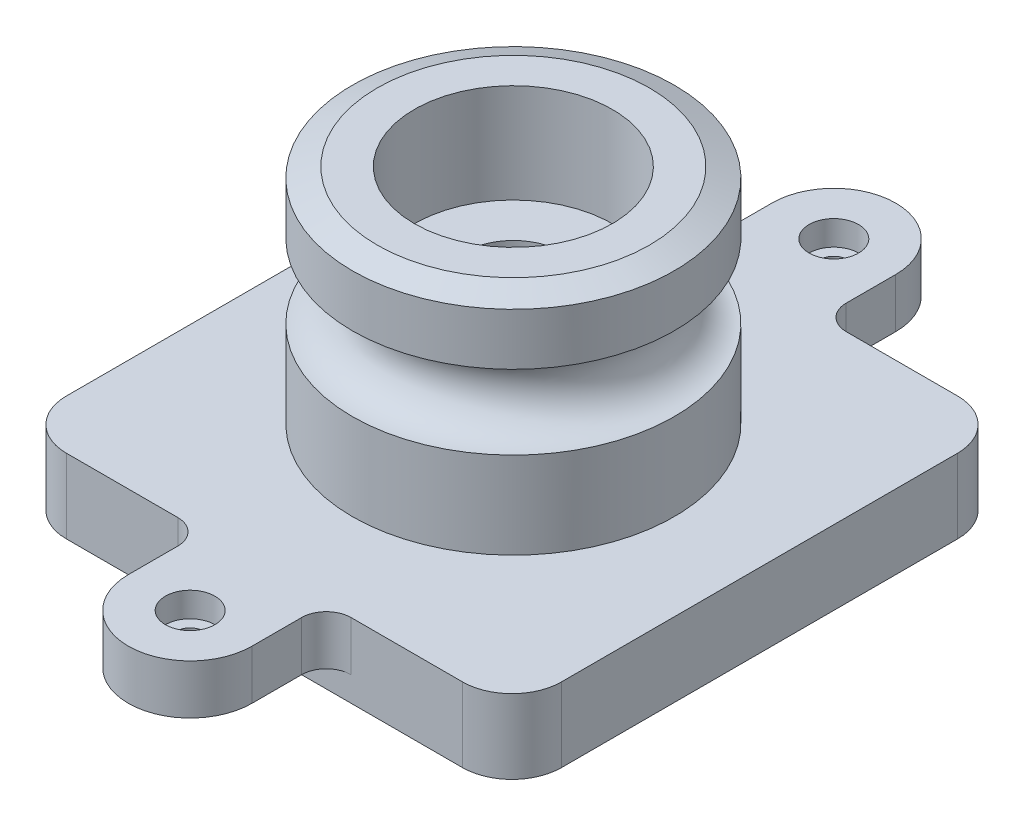
ISO-10303-21;
HEADER;
FILE_DESCRIPTION(('STEP AP214'),'2;1');
FILE_NAME('part.step','',(''),(''),'','','');
FILE_SCHEMA(('AUTOMOTIVE_DESIGN { 1 0 10303 214 1 1 1 1 }'));
ENDSEC;
DATA;
#1=APPLICATION_CONTEXT('core data for automotive mechanical design processes');
#2=APPLICATION_PROTOCOL_DEFINITION('international standard','automotive_design',2000,#1);
#3=PRODUCT_CONTEXT('',#1,'mechanical');
#4=PRODUCT('Part','Part','',(#3));
#5=PRODUCT_RELATED_PRODUCT_CATEGORY('part','',(#4));
#6=PRODUCT_DEFINITION_FORMATION('','',#4);
#7=PRODUCT_DEFINITION_CONTEXT('part definition',#1,'design');
#8=PRODUCT_DEFINITION('design','',#6,#7);
#9=PRODUCT_DEFINITION_SHAPE('','',#8);
#10=(LENGTH_UNIT() NAMED_UNIT(*) SI_UNIT(.MILLI.,.METRE.));
#11=(NAMED_UNIT(*) PLANE_ANGLE_UNIT() SI_UNIT($,.RADIAN.));
#12=(NAMED_UNIT(*) SI_UNIT($,.STERADIAN.) SOLID_ANGLE_UNIT());
#13=UNCERTAINTY_MEASURE_WITH_UNIT(LENGTH_MEASURE(1.E-05),#10,'distance_accuracy_value','');
#14=(GEOMETRIC_REPRESENTATION_CONTEXT(3) GLOBAL_UNCERTAINTY_ASSIGNED_CONTEXT((#13)) GLOBAL_UNIT_ASSIGNED_CONTEXT((#10,
#11,#12)) REPRESENTATION_CONTEXT('',''));
#15=CARTESIAN_POINT('',(0.,0.,0.));
#16=DIRECTION('',(0.,0.,1.));
#17=DIRECTION('',(1.,0.,0.));
#18=AXIS2_PLACEMENT_3D('',#15,#16,#17);
#19=CARTESIAN_POINT('',(0.,15.,0.));
#20=DIRECTION('',(0.,0.,-1.));
#21=DIRECTION('',(-1.,0.,0.));
#22=AXIS2_PLACEMENT_3D('',#19,#20,#21);
#23=PLANE('',#22);
#24=DIRECTION('',(1.,0.,0.));
#25=VECTOR('',#24,1.);
#26=CARTESIAN_POINT('',(0.,0.,0.));
#27=LINE('',#26,#25);
#28=CARTESIAN_POINT('',(10.,0.,0.));
#29=VERTEX_POINT('',#28);
#30=CARTESIAN_POINT('',(90.,0.,0.));
#31=VERTEX_POINT('',#30);
#32=EDGE_CURVE('E259',#29,#31,#27,.T.);
#33=ORIENTED_EDGE('',*,*,#32,.T.);
#34=DIRECTION('',(0.,-1.,0.));
#35=VECTOR('',#34,1.);
#36=CARTESIAN_POINT('',(90.,15.,0.));
#37=LINE('',#36,#35);
#38=CARTESIAN_POINT('',(90.,15.,0.));
#39=VERTEX_POINT('',#38);
#40=EDGE_CURVE('E328',#31,#39,#37,.F.);
#41=ORIENTED_EDGE('',*,*,#40,.T.);
#42=DIRECTION('',(1.,0.,0.));
#43=VECTOR('',#42,1.);
#44=CARTESIAN_POINT('',(0.,15.,0.));
#45=LINE('',#44,#43);
#46=CARTESIAN_POINT('',(67.5,15.,0.));
#47=VERTEX_POINT('',#46);
#48=EDGE_CURVE('E248',#47,#39,#45,.T.);
#49=ORIENTED_EDGE('',*,*,#48,.F.);
#50=DIRECTION('',(0.,1.,0.));
#51=VECTOR('',#50,1.);
#52=CARTESIAN_POINT('',(67.5,15.,0.));
#53=LINE('',#52,#51);
#54=CARTESIAN_POINT('',(67.5,5.00000000000001,0.));
#55=VERTEX_POINT('',#54);
#56=EDGE_CURVE('E278',#47,#55,#53,.F.);
#57=ORIENTED_EDGE('',*,*,#56,.T.);
#58=DIRECTION('',(-1.,0.,0.));
#59=VECTOR('',#58,1.);
#60=CARTESIAN_POINT('',(37.5,5.00000000000001,0.));
#61=LINE('',#60,#59);
#62=CARTESIAN_POINT('',(32.5,5.00000000000001,0.));
#63=VERTEX_POINT('',#62);
#64=EDGE_CURVE('E210',#55,#63,#61,.T.);
#65=ORIENTED_EDGE('',*,*,#64,.T.);
#66=DIRECTION('',(0.,1.,0.));
#67=VECTOR('',#66,1.);
#68=CARTESIAN_POINT('',(32.5,15.,0.));
#69=LINE('',#68,#67);
#70=CARTESIAN_POINT('',(32.5,15.,0.));
#71=VERTEX_POINT('',#70);
#72=EDGE_CURVE('E275',#63,#71,#69,.T.);
#73=ORIENTED_EDGE('',*,*,#72,.T.);
#74=CARTESIAN_POINT('',(10.,15.,0.));
#75=VERTEX_POINT('',#74);
#76=EDGE_CURVE('E250',#75,#71,#45,.T.);
#77=ORIENTED_EDGE('',*,*,#76,.F.);
#78=DIRECTION('',(0.,-1.,0.));
#79=VECTOR('',#78,1.);
#80=CARTESIAN_POINT('',(10.,15.,0.));
#81=LINE('',#80,#79);
#82=EDGE_CURVE('E325',#75,#29,#81,.T.);
#83=ORIENTED_EDGE('',*,*,#82,.T.);
#84=EDGE_LOOP('',(#33,#41,#49,#57,#65,#73,#77,#83));
#85=FACE_BOUND('',#84,.T.);
#86=ADVANCED_FACE('F43',(#85),#23,.F.);
#87=CARTESIAN_POINT('',(0.,15.,-100.));
#88=DIRECTION('',(0.,0.,1.));
#89=DIRECTION('',(1.,0.,0.));
#90=AXIS2_PLACEMENT_3D('',#87,#88,#89);
#91=PLANE('',#90);
#92=DIRECTION('',(-1.,0.,0.));
#93=VECTOR('',#92,1.);
#94=CARTESIAN_POINT('',(0.,15.,-100.));
#95=LINE('',#94,#93);
#96=CARTESIAN_POINT('',(90.,15.,-100.));
#97=VERTEX_POINT('',#96);
#98=CARTESIAN_POINT('',(67.5,15.,-100.));
#99=VERTEX_POINT('',#98);
#100=EDGE_CURVE('E255',#97,#99,#95,.T.);
#101=ORIENTED_EDGE('',*,*,#100,.F.);
#102=DIRECTION('',(0.,-1.,0.));
#103=VECTOR('',#102,1.);
#104=CARTESIAN_POINT('',(90.,15.,-100.));
#105=LINE('',#104,#103);
#106=CARTESIAN_POINT('',(90.,0.,-100.));
#107=VERTEX_POINT('',#106);
#108=EDGE_CURVE('E338',#97,#107,#105,.T.);
#109=ORIENTED_EDGE('',*,*,#108,.T.);
#110=DIRECTION('',(-1.,0.,0.));
#111=VECTOR('',#110,1.);
#112=CARTESIAN_POINT('',(0.,0.,-100.));
#113=LINE('',#112,#111);
#114=CARTESIAN_POINT('',(10.,0.,-100.));
#115=VERTEX_POINT('',#114);
#116=EDGE_CURVE('E249',#107,#115,#113,.T.);
#117=ORIENTED_EDGE('',*,*,#116,.T.);
#118=DIRECTION('',(0.,-1.,0.));
#119=VECTOR('',#118,1.);
#120=CARTESIAN_POINT('',(10.,15.,-100.));
#121=LINE('',#120,#119);
#122=CARTESIAN_POINT('',(10.,15.,-100.));
#123=VERTEX_POINT('',#122);
#124=EDGE_CURVE('E59',#115,#123,#121,.F.);
#125=ORIENTED_EDGE('',*,*,#124,.T.);
#126=CARTESIAN_POINT('',(32.5,15.,-100.));
#127=VERTEX_POINT('',#126);
#128=EDGE_CURVE('E254',#127,#123,#95,.T.);
#129=ORIENTED_EDGE('',*,*,#128,.F.);
#130=DIRECTION('',(0.,1.,0.));
#131=VECTOR('',#130,1.);
#132=CARTESIAN_POINT('',(32.5,15.,-100.));
#133=LINE('',#132,#131);
#134=CARTESIAN_POINT('',(32.5,5.00000000000001,-100.));
#135=VERTEX_POINT('',#134);
#136=EDGE_CURVE('E283',#127,#135,#133,.F.);
#137=ORIENTED_EDGE('',*,*,#136,.T.);
#138=DIRECTION('',(1.,0.,0.));
#139=VECTOR('',#138,1.);
#140=CARTESIAN_POINT('',(37.5,5.00000000000001,-100.));
#141=LINE('',#140,#139);
#142=CARTESIAN_POINT('',(67.5,5.00000000000001,-100.));
#143=VERTEX_POINT('',#142);
#144=EDGE_CURVE('E222',#135,#143,#141,.T.);
#145=ORIENTED_EDGE('',*,*,#144,.T.);
#146=DIRECTION('',(0.,1.,0.));
#147=VECTOR('',#146,1.);
#148=CARTESIAN_POINT('',(67.5,15.,-100.));
#149=LINE('',#148,#147);
#150=EDGE_CURVE('E286',#143,#99,#149,.T.);
#151=ORIENTED_EDGE('',*,*,#150,.T.);
#152=EDGE_LOOP('',(#101,#109,#117,#125,#129,#137,#145,#151));
#153=FACE_BOUND('',#152,.T.);
#154=ADVANCED_FACE('F365',(#153),#91,.F.);
#155=CARTESIAN_POINT('',(0.,15.,0.));
#156=DIRECTION('',(1.,0.,0.));
#157=DIRECTION('',(0.,0.,-1.));
#158=AXIS2_PLACEMENT_3D('',#155,#156,#157);
#159=PLANE('',#158);
#160=DIRECTION('',(0.,0.,1.));
#161=VECTOR('',#160,1.);
#162=CARTESIAN_POINT('',(0.,0.,0.));
#163=LINE('',#162,#161);
#164=CARTESIAN_POINT('',(0.,0.,-90.));
#165=VERTEX_POINT('',#164);
#166=CARTESIAN_POINT('',(0.,0.,-10.));
#167=VERTEX_POINT('',#166);
#168=EDGE_CURVE('E242',#165,#167,#163,.T.);
#169=ORIENTED_EDGE('',*,*,#168,.T.);
#170=DIRECTION('',(0.,-1.,0.));
#171=VECTOR('',#170,1.);
#172=CARTESIAN_POINT('',(0.,15.,-10.));
#173=LINE('',#172,#171);
#174=CARTESIAN_POINT('',(0.,15.,-10.));
#175=VERTEX_POINT('',#174);
#176=EDGE_CURVE('E344',#167,#175,#173,.F.);
#177=ORIENTED_EDGE('',*,*,#176,.T.);
#178=DIRECTION('',(0.,0.,1.));
#179=VECTOR('',#178,1.);
#180=CARTESIAN_POINT('',(0.,15.,0.));
#181=LINE('',#180,#179);
#182=CARTESIAN_POINT('',(0.,15.,-90.));
#183=VERTEX_POINT('',#182);
#184=EDGE_CURVE('E245',#183,#175,#181,.T.);
#185=ORIENTED_EDGE('',*,*,#184,.F.);
#186=DIRECTION('',(0.,-1.,0.));
#187=VECTOR('',#186,1.);
#188=CARTESIAN_POINT('',(0.,15.,-90.));
#189=LINE('',#188,#187);
#190=EDGE_CURVE('E341',#183,#165,#189,.T.);
#191=ORIENTED_EDGE('',*,*,#190,.T.);
#192=EDGE_LOOP('',(#169,#177,#185,#191));
#193=FACE_BOUND('',#192,.T.);
#194=ADVANCED_FACE('F371',(#193),#159,.F.);
#195=CARTESIAN_POINT('',(100.,15.,0.));
#196=DIRECTION('',(-1.,0.,0.));
#197=DIRECTION('',(0.,0.,1.));
#198=AXIS2_PLACEMENT_3D('',#195,#196,#197);
#199=PLANE('',#198);
#200=DIRECTION('',(0.,0.,-1.));
#201=VECTOR('',#200,1.);
#202=CARTESIAN_POINT('',(100.,15.,0.));
#203=LINE('',#202,#201);
#204=CARTESIAN_POINT('',(100.,15.,-10.));
#205=VERTEX_POINT('',#204);
#206=CARTESIAN_POINT('',(100.,15.,-90.));
#207=VERTEX_POINT('',#206);
#208=EDGE_CURVE('E252',#205,#207,#203,.T.);
#209=ORIENTED_EDGE('',*,*,#208,.F.);
#210=DIRECTION('',(0.,-1.,0.));
#211=VECTOR('',#210,1.);
#212=CARTESIAN_POINT('',(100.,15.,-10.));
#213=LINE('',#212,#211);
#214=CARTESIAN_POINT('',(100.,0.,-10.));
#215=VERTEX_POINT('',#214);
#216=EDGE_CURVE('E314',#205,#215,#213,.T.);
#217=ORIENTED_EDGE('',*,*,#216,.T.);
#218=DIRECTION('',(0.,0.,-1.));
#219=VECTOR('',#218,1.);
#220=CARTESIAN_POINT('',(100.,0.,0.));
#221=LINE('',#220,#219);
#222=CARTESIAN_POINT('',(100.,0.,-90.));
#223=VERTEX_POINT('',#222);
#224=EDGE_CURVE('E262',#215,#223,#221,.T.);
#225=ORIENTED_EDGE('',*,*,#224,.T.);
#226=DIRECTION('',(0.,-1.,0.));
#227=VECTOR('',#226,1.);
#228=CARTESIAN_POINT('',(100.,15.,-90.));
#229=LINE('',#228,#227);
#230=EDGE_CURVE('E312',#223,#207,#229,.F.);
#231=ORIENTED_EDGE('',*,*,#230,.T.);
#232=EDGE_LOOP('',(#209,#217,#225,#231));
#233=FACE_BOUND('',#232,.T.);
#234=ADVANCED_FACE('F375',(#233),#199,.F.);
#235=CARTESIAN_POINT('',(0.,15.,0.));
#236=DIRECTION('',(0.,-1.,0.));
#237=DIRECTION('',(0.,0.,-1.));
#238=AXIS2_PLACEMENT_3D('',#235,#236,#237);
#239=PLANE('',#238);
#240=CARTESIAN_POINT('',(50.,15.,-50.2747064861329));
#241=DIRECTION('',(0.,-1.,0.));
#242=DIRECTION('',(0.,0.,-1.));
#243=AXIS2_PLACEMENT_3D('',#240,#241,#242);
#244=CIRCLE('',#243,32.5);
#245=CARTESIAN_POINT('',(50.,15.,-82.7747064861329));
#246=VERTEX_POINT('',#245);
#247=EDGE_CURVE('E346',#246,#246,#244,.F.);
#248=ORIENTED_EDGE('',*,*,#247,.F.);
#249=EDGE_LOOP('',(#248));
#250=FACE_BOUND('',#249,.T.);
#251=CARTESIAN_POINT('',(50.,15.,-115.));
#252=DIRECTION('',(0.,1.,0.));
#253=DIRECTION('',(0.,0.,1.));
#254=AXIS2_PLACEMENT_3D('',#251,#252,#253);
#255=CIRCLE('',#254,5.);
#256=CARTESIAN_POINT('',(50.,15.,-110.));
#257=VERTEX_POINT('',#256);
#258=EDGE_CURVE('E446',#257,#257,#255,.T.);
#259=ORIENTED_EDGE('',*,*,#258,.F.);
#260=EDGE_LOOP('',(#259));
#261=FACE_BOUND('',#260,.T.);
#262=CARTESIAN_POINT('',(50.,15.,15.));
#263=DIRECTION('',(0.,1.,0.));
#264=DIRECTION('',(0.,0.,1.));
#265=AXIS2_PLACEMENT_3D('',#262,#263,#264);
#266=CIRCLE('',#265,5.);
#267=CARTESIAN_POINT('',(50.,15.,20.));
#268=VERTEX_POINT('',#267);
#269=EDGE_CURVE('E272',#268,#268,#266,.T.);
#270=ORIENTED_EDGE('',*,*,#269,.F.);
#271=EDGE_LOOP('',(#270));
#272=FACE_BOUND('',#271,.T.);
#273=ORIENTED_EDGE('',*,*,#48,.T.);
#274=CARTESIAN_POINT('',(90.,15.,-10.));
#275=DIRECTION('',(0.,-1.,0.));
#276=DIRECTION('',(0.,0.,-1.));
#277=AXIS2_PLACEMENT_3D('',#274,#275,#276);
#278=CIRCLE('',#277,10.);
#279=EDGE_CURVE('E335',#39,#205,#278,.F.);
#280=ORIENTED_EDGE('',*,*,#279,.T.);
#281=ORIENTED_EDGE('',*,*,#208,.T.);
#282=CARTESIAN_POINT('',(90.,15.,-90.));
#283=DIRECTION('',(0.,-1.,0.));
#284=DIRECTION('',(0.,0.,-1.));
#285=AXIS2_PLACEMENT_3D('',#282,#283,#284);
#286=CIRCLE('',#285,10.);
#287=EDGE_CURVE('E67',#207,#97,#286,.F.);
#288=ORIENTED_EDGE('',*,*,#287,.T.);
#289=ORIENTED_EDGE('',*,*,#100,.T.);
#290=CARTESIAN_POINT('',(67.5,15.,-105.));
#291=DIRECTION('',(0.,-1.,0.));
#292=DIRECTION('',(0.,0.,-1.));
#293=AXIS2_PLACEMENT_3D('',#290,#291,#292);
#294=CIRCLE('',#293,5.);
#295=CARTESIAN_POINT('',(62.5,15.,-105.));
#296=VERTEX_POINT('',#295);
#297=EDGE_CURVE('E303',#99,#296,#294,.T.);
#298=ORIENTED_EDGE('',*,*,#297,.T.);
#299=DIRECTION('',(0.,0.,-1.));
#300=VECTOR('',#299,1.);
#301=CARTESIAN_POINT('',(62.5,15.,-100.));
#302=LINE('',#301,#300);
#303=CARTESIAN_POINT('',(62.5,15.,-115.));
#304=VERTEX_POINT('',#303);
#305=EDGE_CURVE('E217',#296,#304,#302,.T.);
#306=ORIENTED_EDGE('',*,*,#305,.T.);
#307=CARTESIAN_POINT('',(50.,15.,-115.));
#308=DIRECTION('',(0.,1.,0.));
#309=DIRECTION('',(0.,0.,1.));
#310=AXIS2_PLACEMENT_3D('',#307,#308,#309);
#311=CIRCLE('',#310,12.5);
#312=CARTESIAN_POINT('',(37.5,15.,-115.));
#313=VERTEX_POINT('',#312);
#314=EDGE_CURVE('E235',#304,#313,#311,.T.);
#315=ORIENTED_EDGE('',*,*,#314,.T.);
#316=DIRECTION('',(0.,0.,1.));
#317=VECTOR('',#316,1.);
#318=CARTESIAN_POINT('',(37.5,15.,-100.));
#319=LINE('',#318,#317);
#320=CARTESIAN_POINT('',(37.5,15.,-105.));
#321=VERTEX_POINT('',#320);
#322=EDGE_CURVE('E225',#313,#321,#319,.T.);
#323=ORIENTED_EDGE('',*,*,#322,.T.);
#324=CARTESIAN_POINT('',(32.5,15.,-105.));
#325=DIRECTION('',(0.,-1.,0.));
#326=DIRECTION('',(0.,0.,-1.));
#327=AXIS2_PLACEMENT_3D('',#324,#325,#326);
#328=CIRCLE('',#327,5.);
#329=EDGE_CURVE('E308',#321,#127,#328,.T.);
#330=ORIENTED_EDGE('',*,*,#329,.T.);
#331=ORIENTED_EDGE('',*,*,#128,.T.);
#332=CARTESIAN_POINT('',(10.,15.,-90.));
#333=DIRECTION('',(0.,-1.,0.));
#334=DIRECTION('',(0.,0.,-1.));
#335=AXIS2_PLACEMENT_3D('',#332,#333,#334);
#336=CIRCLE('',#335,10.);
#337=EDGE_CURVE('E330',#123,#183,#336,.F.);
#338=ORIENTED_EDGE('',*,*,#337,.T.);
#339=ORIENTED_EDGE('',*,*,#184,.T.);
#340=CARTESIAN_POINT('',(10.,15.,-10.));
#341=DIRECTION('',(0.,-1.,0.));
#342=DIRECTION('',(0.,0.,-1.));
#343=AXIS2_PLACEMENT_3D('',#340,#341,#342);
#344=CIRCLE('',#343,10.);
#345=EDGE_CURVE('E332',#175,#75,#344,.F.);
#346=ORIENTED_EDGE('',*,*,#345,.T.);
#347=ORIENTED_EDGE('',*,*,#76,.T.);
#348=CARTESIAN_POINT('',(32.5,15.,5.));
#349=DIRECTION('',(0.,-1.,0.));
#350=DIRECTION('',(0.,0.,-1.));
#351=AXIS2_PLACEMENT_3D('',#348,#349,#350);
#352=CIRCLE('',#351,5.);
#353=CARTESIAN_POINT('',(37.5,15.,5.));
#354=VERTEX_POINT('',#353);
#355=EDGE_CURVE('E298',#71,#354,#352,.T.);
#356=ORIENTED_EDGE('',*,*,#355,.T.);
#357=DIRECTION('',(0.,0.,1.));
#358=VECTOR('',#357,1.);
#359=CARTESIAN_POINT('',(37.5,15.,0.));
#360=LINE('',#359,#358);
#361=CARTESIAN_POINT('',(37.5,15.,15.));
#362=VERTEX_POINT('',#361);
#363=EDGE_CURVE('E203',#354,#362,#360,.T.);
#364=ORIENTED_EDGE('',*,*,#363,.T.);
#365=CARTESIAN_POINT('',(50.,15.,15.));
#366=DIRECTION('',(0.,1.,0.));
#367=DIRECTION('',(0.,0.,1.));
#368=AXIS2_PLACEMENT_3D('',#365,#366,#367);
#369=CIRCLE('',#368,12.5);
#370=CARTESIAN_POINT('',(62.5,15.,15.));
#371=VERTEX_POINT('',#370);
#372=EDGE_CURVE('E188',#362,#371,#369,.T.);
#373=ORIENTED_EDGE('',*,*,#372,.T.);
#374=DIRECTION('',(0.,0.,-1.));
#375=VECTOR('',#374,1.);
#376=CARTESIAN_POINT('',(62.5,15.,0.));
#377=LINE('',#376,#375);
#378=CARTESIAN_POINT('',(62.5,15.,4.99999999999999));
#379=VERTEX_POINT('',#378);
#380=EDGE_CURVE('E201',#371,#379,#377,.T.);
#381=ORIENTED_EDGE('',*,*,#380,.T.);
#382=CARTESIAN_POINT('',(67.5,15.,5.));
#383=DIRECTION('',(0.,-1.,0.));
#384=DIRECTION('',(0.,0.,-1.));
#385=AXIS2_PLACEMENT_3D('',#382,#383,#384);
#386=CIRCLE('',#385,5.);
#387=EDGE_CURVE('E294',#379,#47,#386,.T.);
#388=ORIENTED_EDGE('',*,*,#387,.T.);
#389=EDGE_LOOP('',(#273,#280,#281,#288,#289,#298,#306,#315,#323,#330,#331,#338,#339,#346,#347,
#356,#364,#373,#381,#388));
#390=FACE_BOUND('',#389,.T.);
#391=ADVANCED_FACE('F200',(#250,#261,#272,#390),#239,.F.);
#392=CARTESIAN_POINT('',(0.,0.,0.));
#393=DIRECTION('',(0.,-1.,0.));
#394=DIRECTION('',(0.,0.,-1.));
#395=AXIS2_PLACEMENT_3D('',#392,#393,#394);
#396=PLANE('',#395);
#397=CARTESIAN_POINT('',(50.,0.,-50.2747064861329));
#398=DIRECTION('',(0.,1.,0.));
#399=DIRECTION('',(0.,0.,1.));
#400=AXIS2_PLACEMENT_3D('',#397,#398,#399);
#401=CIRCLE('',#400,9.99999999999998);
#402=CARTESIAN_POINT('',(50.,0.,-40.2747064861329));
#403=VERTEX_POINT('',#402);
#404=EDGE_CURVE('E455',#403,#403,#401,.T.);
#405=ORIENTED_EDGE('',*,*,#404,.T.);
#406=EDGE_LOOP('',(#405));
#407=FACE_BOUND('',#406,.T.);
#408=ORIENTED_EDGE('',*,*,#224,.F.);
#409=CARTESIAN_POINT('',(90.,0.,-10.));
#410=DIRECTION('',(0.,-1.,0.));
#411=DIRECTION('',(0.,0.,-1.));
#412=AXIS2_PLACEMENT_3D('',#409,#410,#411);
#413=CIRCLE('',#412,10.);
#414=EDGE_CURVE('E323',#215,#31,#413,.T.);
#415=ORIENTED_EDGE('',*,*,#414,.T.);
#416=ORIENTED_EDGE('',*,*,#32,.F.);
#417=CARTESIAN_POINT('',(10.,0.,-10.));
#418=DIRECTION('',(0.,-1.,0.));
#419=DIRECTION('',(0.,0.,-1.));
#420=AXIS2_PLACEMENT_3D('',#417,#418,#419);
#421=CIRCLE('',#420,10.);
#422=EDGE_CURVE('E319',#29,#167,#421,.T.);
#423=ORIENTED_EDGE('',*,*,#422,.T.);
#424=ORIENTED_EDGE('',*,*,#168,.F.);
#425=CARTESIAN_POINT('',(10.,0.,-90.));
#426=DIRECTION('',(0.,-1.,0.));
#427=DIRECTION('',(0.,0.,-1.));
#428=AXIS2_PLACEMENT_3D('',#425,#426,#427);
#429=CIRCLE('',#428,10.);
#430=EDGE_CURVE('E317',#165,#115,#429,.T.);
#431=ORIENTED_EDGE('',*,*,#430,.T.);
#432=ORIENTED_EDGE('',*,*,#116,.F.);
#433=CARTESIAN_POINT('',(90.,0.,-90.));
#434=DIRECTION('',(0.,-1.,0.));
#435=DIRECTION('',(0.,0.,-1.));
#436=AXIS2_PLACEMENT_3D('',#433,#434,#435);
#437=CIRCLE('',#436,10.);
#438=EDGE_CURVE('E321',#107,#223,#437,.T.);
#439=ORIENTED_EDGE('',*,*,#438,.T.);
#440=EDGE_LOOP('',(#408,#415,#416,#423,#424,#431,#432,#439));
#441=FACE_BOUND('',#440,.T.);
#442=ADVANCED_FACE('F527',(#407,#441),#396,.T.);
#443=CARTESIAN_POINT('',(37.5,5.00000000000001,-100.));
#444=DIRECTION('',(-1.,0.,0.));
#445=DIRECTION('',(0.,0.,1.));
#446=AXIS2_PLACEMENT_3D('',#443,#444,#445);
#447=PLANE('',#446);
#448=DIRECTION('',(0.,0.,1.));
#449=VECTOR('',#448,1.);
#450=CARTESIAN_POINT('',(37.5,5.00000000000001,-100.));
#451=LINE('',#450,#449);
#452=CARTESIAN_POINT('',(37.5,5.00000000000001,-115.));
#453=VERTEX_POINT('',#452);
#454=CARTESIAN_POINT('',(37.5,5.00000000000001,-105.));
#455=VERTEX_POINT('',#454);
#456=EDGE_CURVE('E230',#453,#455,#451,.T.);
#457=ORIENTED_EDGE('',*,*,#456,.T.);
#458=DIRECTION('',(0.,1.,0.));
#459=VECTOR('',#458,1.);
#460=CARTESIAN_POINT('',(37.5,5.00000000000001,-105.));
#461=LINE('',#460,#459);
#462=EDGE_CURVE('E291',#455,#321,#461,.T.);
#463=ORIENTED_EDGE('',*,*,#462,.T.);
#464=ORIENTED_EDGE('',*,*,#322,.F.);
#465=DIRECTION('',(0.,1.,0.));
#466=VECTOR('',#465,1.);
#467=CARTESIAN_POINT('',(37.5,5.00000000000001,-115.));
#468=LINE('',#467,#466);
#469=EDGE_CURVE('E240',#453,#313,#468,.T.);
#470=ORIENTED_EDGE('',*,*,#469,.F.);
#471=EDGE_LOOP('',(#457,#463,#464,#470));
#472=FACE_BOUND('',#471,.T.);
#473=ADVANCED_FACE('F523',(#472),#447,.T.);
#474=CARTESIAN_POINT('',(50.,5.00000000000001,-115.));
#475=DIRECTION('',(0.,1.,0.));
#476=DIRECTION('',(0.,0.,1.));
#477=AXIS2_PLACEMENT_3D('',#474,#475,#476);
#478=CYLINDRICAL_SURFACE('',#477,12.5);
#479=ORIENTED_EDGE('',*,*,#314,.F.);
#480=DIRECTION('',(0.,1.,0.));
#481=VECTOR('',#480,1.);
#482=CARTESIAN_POINT('',(62.5,5.00000000000001,-115.));
#483=LINE('',#482,#481);
#484=CARTESIAN_POINT('',(62.5,5.00000000000001,-115.));
#485=VERTEX_POINT('',#484);
#486=EDGE_CURVE('E233',#485,#304,#483,.T.);
#487=ORIENTED_EDGE('',*,*,#486,.F.);
#488=CARTESIAN_POINT('',(50.,5.00000000000001,-115.));
#489=DIRECTION('',(0.,1.,0.));
#490=DIRECTION('',(0.,0.,1.));
#491=AXIS2_PLACEMENT_3D('',#488,#489,#490);
#492=CIRCLE('',#491,12.5);
#493=EDGE_CURVE('E227',#485,#453,#492,.T.);
#494=ORIENTED_EDGE('',*,*,#493,.T.);
#495=ORIENTED_EDGE('',*,*,#469,.T.);
#496=EDGE_LOOP('',(#479,#487,#494,#495));
#497=FACE_BOUND('',#496,.T.);
#498=ADVANCED_FACE('F526',(#497),#478,.T.);
#499=CARTESIAN_POINT('',(62.5,5.00000000000001,-100.));
#500=DIRECTION('',(1.,0.,0.));
#501=DIRECTION('',(0.,0.,-1.));
#502=AXIS2_PLACEMENT_3D('',#499,#500,#501);
#503=PLANE('',#502);
#504=ORIENTED_EDGE('',*,*,#305,.F.);
#505=DIRECTION('',(0.,1.,0.));
#506=VECTOR('',#505,1.);
#507=CARTESIAN_POINT('',(62.5,5.00000000000001,-105.));
#508=LINE('',#507,#506);
#509=CARTESIAN_POINT('',(62.5,5.00000000000001,-105.));
#510=VERTEX_POINT('',#509);
#511=EDGE_CURVE('E289',#296,#510,#508,.F.);
#512=ORIENTED_EDGE('',*,*,#511,.T.);
#513=DIRECTION('',(0.,0.,-1.));
#514=VECTOR('',#513,1.);
#515=CARTESIAN_POINT('',(62.5,5.00000000000001,-100.));
#516=LINE('',#515,#514);
#517=EDGE_CURVE('E224',#510,#485,#516,.T.);
#518=ORIENTED_EDGE('',*,*,#517,.T.);
#519=ORIENTED_EDGE('',*,*,#486,.T.);
#520=EDGE_LOOP('',(#504,#512,#518,#519));
#521=FACE_BOUND('',#520,.T.);
#522=ADVANCED_FACE('F521',(#521),#503,.T.);
#523=CARTESIAN_POINT('',(50.,5.00000000000001,-115.));
#524=DIRECTION('',(0.,1.,0.));
#525=DIRECTION('',(0.,0.,1.));
#526=AXIS2_PLACEMENT_3D('',#523,#524,#525);
#527=PLANE('',#526);
#528=CARTESIAN_POINT('',(50.,5.00000000000001,-115.));
#529=DIRECTION('',(0.,1.,0.));
#530=DIRECTION('',(0.,0.,1.));
#531=AXIS2_PLACEMENT_3D('',#528,#529,#530);
#532=CIRCLE('',#531,2.75);
#533=CARTESIAN_POINT('',(50.,5.00000000000001,-112.25));
#534=VERTEX_POINT('',#533);
#535=EDGE_CURVE('E269',#534,#534,#532,.T.);
#536=ORIENTED_EDGE('',*,*,#535,.T.);
#537=EDGE_LOOP('',(#536));
#538=FACE_BOUND('',#537,.T.);
#539=ORIENTED_EDGE('',*,*,#144,.F.);
#540=CARTESIAN_POINT('',(32.5,5.00000000000001,-105.));
#541=DIRECTION('',(0.,1.,0.));
#542=DIRECTION('',(0.,0.,1.));
#543=AXIS2_PLACEMENT_3D('',#540,#541,#542);
#544=CIRCLE('',#543,5.);
#545=EDGE_CURVE('E310',#135,#455,#544,.T.);
#546=ORIENTED_EDGE('',*,*,#545,.T.);
#547=ORIENTED_EDGE('',*,*,#456,.F.);
#548=ORIENTED_EDGE('',*,*,#493,.F.);
#549=ORIENTED_EDGE('',*,*,#517,.F.);
#550=CARTESIAN_POINT('',(67.5,5.00000000000001,-105.));
#551=DIRECTION('',(0.,1.,0.));
#552=DIRECTION('',(0.,0.,1.));
#553=AXIS2_PLACEMENT_3D('',#550,#551,#552);
#554=CIRCLE('',#553,5.);
#555=EDGE_CURVE('E305',#510,#143,#554,.T.);
#556=ORIENTED_EDGE('',*,*,#555,.T.);
#557=EDGE_LOOP('',(#539,#546,#547,#548,#549,#556));
#558=FACE_BOUND('',#557,.T.);
#559=ADVANCED_FACE('F515',(#538,#558),#527,.F.);
#560=CARTESIAN_POINT('',(62.5,5.00000000000001,0.));
#561=DIRECTION('',(1.,0.,0.));
#562=DIRECTION('',(0.,0.,-1.));
#563=AXIS2_PLACEMENT_3D('',#560,#561,#562);
#564=PLANE('',#563);
#565=DIRECTION('',(0.,0.,-1.));
#566=VECTOR('',#565,1.);
#567=CARTESIAN_POINT('',(62.5,5.00000000000001,0.));
#568=LINE('',#567,#566);
#569=CARTESIAN_POINT('',(62.5,5.00000000000001,15.));
#570=VERTEX_POINT('',#569);
#571=CARTESIAN_POINT('',(62.5,5.00000000000001,4.99999999999999));
#572=VERTEX_POINT('',#571);
#573=EDGE_CURVE('E218',#570,#572,#568,.T.);
#574=ORIENTED_EDGE('',*,*,#573,.T.);
#575=DIRECTION('',(0.,1.,0.));
#576=VECTOR('',#575,1.);
#577=CARTESIAN_POINT('',(62.5,5.00000000000001,5.));
#578=LINE('',#577,#576);
#579=EDGE_CURVE('E209',#572,#379,#578,.T.);
#580=ORIENTED_EDGE('',*,*,#579,.T.);
#581=ORIENTED_EDGE('',*,*,#380,.F.);
#582=DIRECTION('',(0.,1.,0.));
#583=VECTOR('',#582,1.);
#584=CARTESIAN_POINT('',(62.5,5.00000000000001,15.));
#585=LINE('',#584,#583);
#586=EDGE_CURVE('E184',#570,#371,#585,.T.);
#587=ORIENTED_EDGE('',*,*,#586,.F.);
#588=EDGE_LOOP('',(#574,#580,#581,#587));
#589=FACE_BOUND('',#588,.T.);
#590=ADVANCED_FACE('F207',(#589),#564,.T.);
#591=CARTESIAN_POINT('',(50.,5.00000000000001,15.));
#592=DIRECTION('',(0.,1.,0.));
#593=DIRECTION('',(0.,0.,1.));
#594=AXIS2_PLACEMENT_3D('',#591,#592,#593);
#595=CYLINDRICAL_SURFACE('',#594,12.5);
#596=ORIENTED_EDGE('',*,*,#372,.F.);
#597=DIRECTION('',(0.,1.,0.));
#598=VECTOR('',#597,1.);
#599=CARTESIAN_POINT('',(37.5,5.00000000000001,15.));
#600=LINE('',#599,#598);
#601=CARTESIAN_POINT('',(37.5,5.00000000000001,15.));
#602=VERTEX_POINT('',#601);
#603=EDGE_CURVE('E195',#602,#362,#600,.T.);
#604=ORIENTED_EDGE('',*,*,#603,.F.);
#605=CARTESIAN_POINT('',(50.,5.00000000000001,15.));
#606=DIRECTION('',(0.,1.,0.));
#607=DIRECTION('',(0.,0.,1.));
#608=AXIS2_PLACEMENT_3D('',#605,#606,#607);
#609=CIRCLE('',#608,12.5);
#610=EDGE_CURVE('E190',#602,#570,#609,.T.);
#611=ORIENTED_EDGE('',*,*,#610,.T.);
#612=ORIENTED_EDGE('',*,*,#586,.T.);
#613=EDGE_LOOP('',(#596,#604,#611,#612));
#614=FACE_BOUND('',#613,.T.);
#615=ADVANCED_FACE('F186',(#614),#595,.T.);
#616=CARTESIAN_POINT('',(37.5,5.00000000000001,0.));
#617=DIRECTION('',(-1.,0.,0.));
#618=DIRECTION('',(0.,0.,1.));
#619=AXIS2_PLACEMENT_3D('',#616,#617,#618);
#620=PLANE('',#619);
#621=ORIENTED_EDGE('',*,*,#363,.F.);
#622=DIRECTION('',(0.,1.,0.));
#623=VECTOR('',#622,1.);
#624=CARTESIAN_POINT('',(37.5,5.00000000000001,5.));
#625=LINE('',#624,#623);
#626=CARTESIAN_POINT('',(37.5,5.00000000000001,5.));
#627=VERTEX_POINT('',#626);
#628=EDGE_CURVE('E281',#354,#627,#625,.F.);
#629=ORIENTED_EDGE('',*,*,#628,.T.);
#630=DIRECTION('',(0.,0.,1.));
#631=VECTOR('',#630,1.);
#632=CARTESIAN_POINT('',(37.5,5.00000000000001,0.));
#633=LINE('',#632,#631);
#634=EDGE_CURVE('E212',#627,#602,#633,.T.);
#635=ORIENTED_EDGE('',*,*,#634,.T.);
#636=ORIENTED_EDGE('',*,*,#603,.T.);
#637=EDGE_LOOP('',(#621,#629,#635,#636));
#638=FACE_BOUND('',#637,.T.);
#639=ADVANCED_FACE('F431',(#638),#620,.T.);
#640=CARTESIAN_POINT('',(50.,5.00000000000001,15.));
#641=DIRECTION('',(0.,1.,0.));
#642=DIRECTION('',(0.,0.,1.));
#643=AXIS2_PLACEMENT_3D('',#640,#641,#642);
#644=PLANE('',#643);
#645=CARTESIAN_POINT('',(50.,5.00000000000001,15.));
#646=DIRECTION('',(0.,1.,0.));
#647=DIRECTION('',(0.,0.,1.));
#648=AXIS2_PLACEMENT_3D('',#645,#646,#647);
#649=CIRCLE('',#648,2.75);
#650=CARTESIAN_POINT('',(50.,5.00000000000001,17.75));
#651=VERTEX_POINT('',#650);
#652=EDGE_CURVE('E196',#651,#651,#649,.T.);
#653=ORIENTED_EDGE('',*,*,#652,.T.);
#654=EDGE_LOOP('',(#653));
#655=FACE_BOUND('',#654,.T.);
#656=ORIENTED_EDGE('',*,*,#64,.F.);
#657=CARTESIAN_POINT('',(67.5,5.00000000000001,5.));
#658=DIRECTION('',(0.,1.,0.));
#659=DIRECTION('',(0.,0.,1.));
#660=AXIS2_PLACEMENT_3D('',#657,#658,#659);
#661=CIRCLE('',#660,5.);
#662=EDGE_CURVE('E296',#55,#572,#661,.T.);
#663=ORIENTED_EDGE('',*,*,#662,.T.);
#664=ORIENTED_EDGE('',*,*,#573,.F.);
#665=ORIENTED_EDGE('',*,*,#610,.F.);
#666=ORIENTED_EDGE('',*,*,#634,.F.);
#667=CARTESIAN_POINT('',(32.5,5.00000000000001,5.));
#668=DIRECTION('',(0.,1.,0.));
#669=DIRECTION('',(0.,0.,1.));
#670=AXIS2_PLACEMENT_3D('',#667,#668,#669);
#671=CIRCLE('',#670,5.);
#672=EDGE_CURVE('E300',#627,#63,#671,.T.);
#673=ORIENTED_EDGE('',*,*,#672,.T.);
#674=EDGE_LOOP('',(#656,#663,#664,#665,#666,#673));
#675=FACE_BOUND('',#674,.T.);
#676=ADVANCED_FACE('F507',(#655,#675),#644,.F.);
#677=CARTESIAN_POINT('',(50.,15.,15.));
#678=DIRECTION('',(0.,1.,0.));
#679=DIRECTION('',(0.,0.,1.));
#680=AXIS2_PLACEMENT_3D('',#677,#678,#679);
#681=CYLINDRICAL_SURFACE('',#680,2.75);
#682=CARTESIAN_POINT('',(50.,10.,15.));
#683=DIRECTION('',(0.,1.,0.));
#684=DIRECTION('',(0.,0.,1.));
#685=AXIS2_PLACEMENT_3D('',#682,#683,#684);
#686=CIRCLE('',#685,2.75);
#687=CARTESIAN_POINT('',(50.,10.,17.75));
#688=VERTEX_POINT('',#687);
#689=EDGE_CURVE('E268',#688,#688,#686,.T.);
#690=ORIENTED_EDGE('',*,*,#689,.T.);
#691=EDGE_LOOP('',(#690));
#692=FACE_BOUND('',#691,.T.);
#693=ORIENTED_EDGE('',*,*,#652,.F.);
#694=EDGE_LOOP('',(#693));
#695=FACE_BOUND('',#694,.T.);
#696=ADVANCED_FACE('F503',(#692,#695),#681,.F.);
#697=CARTESIAN_POINT('',(52.75,10.,15.));
#698=DIRECTION('',(0.,-1.,0.));
#699=DIRECTION('',(0.,0.,-1.));
#700=AXIS2_PLACEMENT_3D('',#697,#698,#699);
#701=PLANE('',#700);
#702=ORIENTED_EDGE('',*,*,#689,.F.);
#703=EDGE_LOOP('',(#702));
#704=FACE_BOUND('',#703,.T.);
#705=CARTESIAN_POINT('',(50.,10.,15.));
#706=DIRECTION('',(0.,1.,0.));
#707=DIRECTION('',(0.,0.,1.));
#708=AXIS2_PLACEMENT_3D('',#705,#706,#707);
#709=CIRCLE('',#708,5.);
#710=CARTESIAN_POINT('',(50.,10.,20.));
#711=VERTEX_POINT('',#710);
#712=EDGE_CURVE('E436',#711,#711,#709,.T.);
#713=ORIENTED_EDGE('',*,*,#712,.T.);
#714=EDGE_LOOP('',(#713));
#715=FACE_BOUND('',#714,.T.);
#716=ADVANCED_FACE('F499',(#704,#715),#701,.F.);
#717=CARTESIAN_POINT('',(50.,15.,15.));
#718=DIRECTION('',(0.,1.,0.));
#719=DIRECTION('',(0.,0.,1.));
#720=AXIS2_PLACEMENT_3D('',#717,#718,#719);
#721=CYLINDRICAL_SURFACE('',#720,5.);
#722=ORIENTED_EDGE('',*,*,#712,.F.);
#723=EDGE_LOOP('',(#722));
#724=FACE_BOUND('',#723,.T.);
#725=ORIENTED_EDGE('',*,*,#269,.T.);
#726=EDGE_LOOP('',(#725));
#727=FACE_BOUND('',#726,.T.);
#728=ADVANCED_FACE('F495',(#724,#727),#721,.F.);
#729=CARTESIAN_POINT('',(50.,15.,-115.));
#730=DIRECTION('',(0.,1.,0.));
#731=DIRECTION('',(0.,0.,1.));
#732=AXIS2_PLACEMENT_3D('',#729,#730,#731);
#733=CYLINDRICAL_SURFACE('',#732,2.75);
#734=CARTESIAN_POINT('',(50.,10.,-115.));
#735=DIRECTION('',(0.,1.,0.));
#736=DIRECTION('',(0.,0.,1.));
#737=AXIS2_PLACEMENT_3D('',#734,#735,#736);
#738=CIRCLE('',#737,2.75);
#739=CARTESIAN_POINT('',(50.,10.,-112.25));
#740=VERTEX_POINT('',#739);
#741=EDGE_CURVE('E273',#740,#740,#738,.T.);
#742=ORIENTED_EDGE('',*,*,#741,.T.);
#743=EDGE_LOOP('',(#742));
#744=FACE_BOUND('',#743,.T.);
#745=ORIENTED_EDGE('',*,*,#535,.F.);
#746=EDGE_LOOP('',(#745));
#747=FACE_BOUND('',#746,.T.);
#748=ADVANCED_FACE('F491',(#744,#747),#733,.F.);
#749=CARTESIAN_POINT('',(52.75,10.,-115.));
#750=DIRECTION('',(0.,-1.,0.));
#751=DIRECTION('',(0.,0.,-1.));
#752=AXIS2_PLACEMENT_3D('',#749,#750,#751);
#753=PLANE('',#752);
#754=ORIENTED_EDGE('',*,*,#741,.F.);
#755=EDGE_LOOP('',(#754));
#756=FACE_BOUND('',#755,.T.);
#757=CARTESIAN_POINT('',(50.,10.,-115.));
#758=DIRECTION('',(0.,1.,0.));
#759=DIRECTION('',(0.,0.,1.));
#760=AXIS2_PLACEMENT_3D('',#757,#758,#759);
#761=CIRCLE('',#760,5.);
#762=CARTESIAN_POINT('',(50.,10.,-110.));
#763=VERTEX_POINT('',#762);
#764=EDGE_CURVE('E443',#763,#763,#761,.T.);
#765=ORIENTED_EDGE('',*,*,#764,.T.);
#766=EDGE_LOOP('',(#765));
#767=FACE_BOUND('',#766,.T.);
#768=ADVANCED_FACE('F487',(#756,#767),#753,.F.);
#769=CARTESIAN_POINT('',(50.,15.,-115.));
#770=DIRECTION('',(0.,1.,0.));
#771=DIRECTION('',(0.,0.,1.));
#772=AXIS2_PLACEMENT_3D('',#769,#770,#771);
#773=CYLINDRICAL_SURFACE('',#772,5.);
#774=ORIENTED_EDGE('',*,*,#764,.F.);
#775=EDGE_LOOP('',(#774));
#776=FACE_BOUND('',#775,.T.);
#777=ORIENTED_EDGE('',*,*,#258,.T.);
#778=EDGE_LOOP('',(#777));
#779=FACE_BOUND('',#778,.T.);
#780=ADVANCED_FACE('F383',(#776,#779),#773,.F.);
#781=CARTESIAN_POINT('',(67.5,5.00000000000001,5.));
#782=DIRECTION('',(0.,1.,0.));
#783=DIRECTION('',(0.,0.,1.));
#784=AXIS2_PLACEMENT_3D('',#781,#782,#783);
#785=CYLINDRICAL_SURFACE('',#784,5.);
#786=ORIENTED_EDGE('',*,*,#662,.F.);
#787=ORIENTED_EDGE('',*,*,#56,.F.);
#788=ORIENTED_EDGE('',*,*,#387,.F.);
#789=ORIENTED_EDGE('',*,*,#579,.F.);
#790=EDGE_LOOP('',(#786,#787,#788,#789));
#791=FACE_BOUND('',#790,.T.);
#792=ADVANCED_FACE('F379',(#791),#785,.F.);
#793=CARTESIAN_POINT('',(32.5,15.,5.));
#794=DIRECTION('',(0.,1.,0.));
#795=DIRECTION('',(0.,0.,1.));
#796=AXIS2_PLACEMENT_3D('',#793,#794,#795);
#797=CYLINDRICAL_SURFACE('',#796,5.);
#798=ORIENTED_EDGE('',*,*,#672,.F.);
#799=ORIENTED_EDGE('',*,*,#628,.F.);
#800=ORIENTED_EDGE('',*,*,#355,.F.);
#801=ORIENTED_EDGE('',*,*,#72,.F.);
#802=EDGE_LOOP('',(#798,#799,#800,#801));
#803=FACE_BOUND('',#802,.T.);
#804=ADVANCED_FACE('F382',(#803),#797,.F.);
#805=CARTESIAN_POINT('',(67.5,15.,-105.));
#806=DIRECTION('',(0.,1.,0.));
#807=DIRECTION('',(0.,0.,1.));
#808=AXIS2_PLACEMENT_3D('',#805,#806,#807);
#809=CYLINDRICAL_SURFACE('',#808,5.);
#810=ORIENTED_EDGE('',*,*,#555,.F.);
#811=ORIENTED_EDGE('',*,*,#511,.F.);
#812=ORIENTED_EDGE('',*,*,#297,.F.);
#813=ORIENTED_EDGE('',*,*,#150,.F.);
#814=EDGE_LOOP('',(#810,#811,#812,#813));
#815=FACE_BOUND('',#814,.T.);
#816=ADVANCED_FACE('F387',(#815),#809,.F.);
#817=CARTESIAN_POINT('',(32.5,5.00000000000001,-105.));
#818=DIRECTION('',(0.,1.,0.));
#819=DIRECTION('',(0.,0.,1.));
#820=AXIS2_PLACEMENT_3D('',#817,#818,#819);
#821=CYLINDRICAL_SURFACE('',#820,5.);
#822=ORIENTED_EDGE('',*,*,#545,.F.);
#823=ORIENTED_EDGE('',*,*,#136,.F.);
#824=ORIENTED_EDGE('',*,*,#329,.F.);
#825=ORIENTED_EDGE('',*,*,#462,.F.);
#826=EDGE_LOOP('',(#822,#823,#824,#825));
#827=FACE_BOUND('',#826,.T.);
#828=ADVANCED_FACE('F391',(#827),#821,.F.);
#829=CARTESIAN_POINT('',(90.,15.,-10.));
#830=DIRECTION('',(0.,-1.,0.));
#831=DIRECTION('',(0.,0.,-1.));
#832=AXIS2_PLACEMENT_3D('',#829,#830,#831);
#833=CYLINDRICAL_SURFACE('',#832,10.);
#834=ORIENTED_EDGE('',*,*,#279,.F.);
#835=ORIENTED_EDGE('',*,*,#40,.F.);
#836=ORIENTED_EDGE('',*,*,#414,.F.);
#837=ORIENTED_EDGE('',*,*,#216,.F.);
#838=EDGE_LOOP('',(#834,#835,#836,#837));
#839=FACE_BOUND('',#838,.T.);
#840=ADVANCED_FACE('F395',(#839),#833,.T.);
#841=CARTESIAN_POINT('',(90.,15.,-90.));
#842=DIRECTION('',(0.,-1.,0.));
#843=DIRECTION('',(0.,0.,-1.));
#844=AXIS2_PLACEMENT_3D('',#841,#842,#843);
#845=CYLINDRICAL_SURFACE('',#844,10.);
#846=ORIENTED_EDGE('',*,*,#287,.F.);
#847=ORIENTED_EDGE('',*,*,#230,.F.);
#848=ORIENTED_EDGE('',*,*,#438,.F.);
#849=ORIENTED_EDGE('',*,*,#108,.F.);
#850=EDGE_LOOP('',(#846,#847,#848,#849));
#851=FACE_BOUND('',#850,.T.);
#852=ADVANCED_FACE('F399',(#851),#845,.T.);
#853=CARTESIAN_POINT('',(10.,15.,-10.));
#854=DIRECTION('',(0.,-1.,0.));
#855=DIRECTION('',(0.,0.,-1.));
#856=AXIS2_PLACEMENT_3D('',#853,#854,#855);
#857=CYLINDRICAL_SURFACE('',#856,10.);
#858=ORIENTED_EDGE('',*,*,#345,.F.);
#859=ORIENTED_EDGE('',*,*,#176,.F.);
#860=ORIENTED_EDGE('',*,*,#422,.F.);
#861=ORIENTED_EDGE('',*,*,#82,.F.);
#862=EDGE_LOOP('',(#858,#859,#860,#861));
#863=FACE_BOUND('',#862,.T.);
#864=ADVANCED_FACE('F403',(#863),#857,.T.);
#865=CARTESIAN_POINT('',(10.,15.,-90.));
#866=DIRECTION('',(0.,-1.,0.));
#867=DIRECTION('',(0.,0.,-1.));
#868=AXIS2_PLACEMENT_3D('',#865,#866,#867);
#869=CYLINDRICAL_SURFACE('',#868,10.);
#870=ORIENTED_EDGE('',*,*,#337,.F.);
#871=ORIENTED_EDGE('',*,*,#124,.F.);
#872=ORIENTED_EDGE('',*,*,#430,.F.);
#873=ORIENTED_EDGE('',*,*,#190,.F.);
#874=EDGE_LOOP('',(#870,#871,#872,#873));
#875=FACE_BOUND('',#874,.T.);
#876=ADVANCED_FACE('F406',(#875),#869,.T.);
#877=CARTESIAN_POINT('',(50.,60.,-50.2747064861329));
#878=DIRECTION('',(0.,1.,0.));
#879=DIRECTION('',(0.,0.,1.));
#880=AXIS2_PLACEMENT_3D('',#877,#878,#879);
#881=CYLINDRICAL_SURFACE('',#880,32.5);
#882=CARTESIAN_POINT('',(50.,32.5,-50.2747064861329));
#883=DIRECTION('',(0.,1.,0.));
#884=DIRECTION('',(0.,0.,1.));
#885=AXIS2_PLACEMENT_3D('',#882,#883,#884);
#886=CIRCLE('',#885,32.5);
#887=CARTESIAN_POINT('',(50.,32.5,-17.7747064861329));
#888=VERTEX_POINT('',#887);
#889=EDGE_CURVE('E449',#888,#888,#886,.T.);
#890=ORIENTED_EDGE('',*,*,#889,.F.);
#891=EDGE_LOOP('',(#890));
#892=FACE_BOUND('',#891,.T.);
#893=ORIENTED_EDGE('',*,*,#247,.T.);
#894=EDGE_LOOP('',(#893));
#895=FACE_BOUND('',#894,.T.);
#896=ADVANCED_FACE('F409',(#892,#895),#881,.T.);
#897=CARTESIAN_POINT('',(50.,40.,-50.2747064861329));
#898=DIRECTION('',(0.,1.,0.));
#899=DIRECTION('',(0.,0.,1.));
#900=AXIS2_PLACEMENT_3D('',#897,#898,#899);
#901=TOROIDAL_SURFACE('',#900,32.5,7.50000000000001);
#902=CARTESIAN_POINT('',(50.,47.5,-50.2747064861329));
#903=DIRECTION('',(0.,1.,0.));
#904=DIRECTION('',(0.,0.,1.));
#905=AXIS2_PLACEMENT_3D('',#902,#903,#904);
#906=CIRCLE('',#905,32.5);
#907=CARTESIAN_POINT('',(50.,47.5,-17.7747064861329));
#908=VERTEX_POINT('',#907);
#909=EDGE_CURVE('E452',#908,#908,#906,.T.);
#910=ORIENTED_EDGE('',*,*,#909,.F.);
#911=EDGE_LOOP('',(#910));
#912=FACE_BOUND('',#911,.T.);
#913=ORIENTED_EDGE('',*,*,#889,.T.);
#914=EDGE_LOOP('',(#913));
#915=FACE_BOUND('',#914,.T.);
#916=ADVANCED_FACE('F414',(#912,#915),#901,.F.);
#917=CARTESIAN_POINT('',(50.,60.,-50.2747064861329));
#918=DIRECTION('',(0.,1.,0.));
#919=DIRECTION('',(0.,0.,1.));
#920=AXIS2_PLACEMENT_3D('',#917,#918,#919);
#921=CYLINDRICAL_SURFACE('',#920,32.5);
#922=CARTESIAN_POINT('',(50.,58.,-50.2747064861329));
#923=DIRECTION('',(0.,-1.,0.));
#924=DIRECTION('',(0.,0.,-1.));
#925=AXIS2_PLACEMENT_3D('',#922,#923,#924);
#926=CIRCLE('',#925,32.5);
#927=CARTESIAN_POINT('',(50.,58.,-82.7747064861329));
#928=VERTEX_POINT('',#927);
#929=EDGE_CURVE('E11',#928,#928,#926,.T.);
#930=ORIENTED_EDGE('',*,*,#929,.T.);
#931=EDGE_LOOP('',(#930));
#932=FACE_BOUND('',#931,.T.);
#933=ORIENTED_EDGE('',*,*,#909,.T.);
#934=EDGE_LOOP('',(#933));
#935=FACE_BOUND('',#934,.T.);
#936=ADVANCED_FACE('F470',(#932,#935),#921,.T.);
#937=CARTESIAN_POINT('',(50.,60.,-50.2747064861329));
#938=DIRECTION('',(0.,-1.,0.));
#939=DIRECTION('',(0.,0.,-1.));
#940=AXIS2_PLACEMENT_3D('',#937,#938,#939);
#941=PLANE('',#940);
#942=CARTESIAN_POINT('',(50.,60.,-50.2747064861329));
#943=DIRECTION('',(0.,-1.,0.));
#944=DIRECTION('',(0.,0.,-1.));
#945=AXIS2_PLACEMENT_3D('',#942,#943,#944);
#946=CIRCLE('',#945,27.4999999999999);
#947=CARTESIAN_POINT('',(50.,60.,-77.7747064861327));
#948=VERTEX_POINT('',#947);
#949=EDGE_CURVE('E52',#948,#948,#946,.F.);
#950=ORIENTED_EDGE('',*,*,#949,.T.);
#951=EDGE_LOOP('',(#950));
#952=FACE_BOUND('',#951,.T.);
#953=CARTESIAN_POINT('',(50.,60.,-50.2747064861329));
#954=DIRECTION('',(0.,1.,0.));
#955=DIRECTION('',(0.,0.,1.));
#956=AXIS2_PLACEMENT_3D('',#953,#954,#955);
#957=CIRCLE('',#956,20.);
#958=CARTESIAN_POINT('',(50.,60.,-30.2747064861329));
#959=VERTEX_POINT('',#958);
#960=EDGE_CURVE('E464',#959,#959,#957,.T.);
#961=ORIENTED_EDGE('',*,*,#960,.F.);
#962=EDGE_LOOP('',(#961));
#963=FACE_BOUND('',#962,.T.);
#964=ADVANCED_FACE('F351',(#952,#963),#941,.F.);
#965=CARTESIAN_POINT('',(50.,60.,-50.2747064861329));
#966=DIRECTION('',(0.,1.,0.));
#967=DIRECTION('',(0.,0.,1.));
#968=AXIS2_PLACEMENT_3D('',#965,#966,#967);
#969=CYLINDRICAL_SURFACE('',#968,9.99999999999999);
#970=ORIENTED_EDGE('',*,*,#404,.F.);
#971=EDGE_LOOP('',(#970));
#972=FACE_BOUND('',#971,.T.);
#973=CARTESIAN_POINT('',(50.,40.,-50.2747064861329));
#974=DIRECTION('',(0.,1.,0.));
#975=DIRECTION('',(0.,0.,1.));
#976=AXIS2_PLACEMENT_3D('',#973,#974,#975);
#977=CIRCLE('',#976,9.99999999999999);
#978=CARTESIAN_POINT('',(50.,40.,-40.2747064861329));
#979=VERTEX_POINT('',#978);
#980=EDGE_CURVE('E458',#979,#979,#977,.T.);
#981=ORIENTED_EDGE('',*,*,#980,.T.);
#982=EDGE_LOOP('',(#981));
#983=FACE_BOUND('',#982,.T.);
#984=ADVANCED_FACE('F469',(#972,#983),#969,.F.);
#985=CARTESIAN_POINT('',(60.,40.,-50.2747064861329));
#986=DIRECTION('',(0.,-1.,0.));
#987=DIRECTION('',(0.,0.,-1.));
#988=AXIS2_PLACEMENT_3D('',#985,#986,#987);
#989=PLANE('',#988);
#990=ORIENTED_EDGE('',*,*,#980,.F.);
#991=EDGE_LOOP('',(#990));
#992=FACE_BOUND('',#991,.T.);
#993=CARTESIAN_POINT('',(50.,40.,-50.2747064861329));
#994=DIRECTION('',(0.,1.,0.));
#995=DIRECTION('',(0.,0.,1.));
#996=AXIS2_PLACEMENT_3D('',#993,#994,#995);
#997=CIRCLE('',#996,20.);
#998=CARTESIAN_POINT('',(50.,40.,-30.2747064861329));
#999=VERTEX_POINT('',#998);
#1000=EDGE_CURVE('E461',#999,#999,#997,.T.);
#1001=ORIENTED_EDGE('',*,*,#1000,.T.);
#1002=EDGE_LOOP('',(#1001));
#1003=FACE_BOUND('',#1002,.T.);
#1004=ADVANCED_FACE('F360',(#992,#1003),#989,.F.);
#1005=CARTESIAN_POINT('',(50.,60.,-50.2747064861329));
#1006=DIRECTION('',(0.,1.,0.));
#1007=DIRECTION('',(0.,0.,1.));
#1008=AXIS2_PLACEMENT_3D('',#1005,#1006,#1007);
#1009=CYLINDRICAL_SURFACE('',#1008,20.);
#1010=ORIENTED_EDGE('',*,*,#1000,.F.);
#1011=EDGE_LOOP('',(#1010));
#1012=FACE_BOUND('',#1011,.T.);
#1013=ORIENTED_EDGE('',*,*,#960,.T.);
#1014=EDGE_LOOP('',(#1013));
#1015=FACE_BOUND('',#1014,.T.);
#1016=ADVANCED_FACE('F355',(#1012,#1015),#1009,.F.);
#1017=CARTESIAN_POINT('',(50.,60.,-50.2747064861329));
#1018=DIRECTION('',(0.,-1.,0.));
#1019=DIRECTION('',(0.,0.,-1.));
#1020=AXIS2_PLACEMENT_3D('',#1017,#1018,#1019);
#1021=CONICAL_SURFACE('',#1020,27.4999999999999,1.19028994968253);
#1022=ORIENTED_EDGE('',*,*,#929,.F.);
#1023=EDGE_LOOP('',(#1022));
#1024=FACE_BOUND('',#1023,.T.);
#1025=ORIENTED_EDGE('',*,*,#949,.F.);
#1026=EDGE_LOOP('',(#1025));
#1027=FACE_BOUND('',#1026,.T.);
#1028=ADVANCED_FACE('F46',(#1024,#1027),#1021,.T.);
#1029=CLOSED_SHELL('',(#86,#154,#194,#234,#391,#442,#473,#498,#522,#559,#590,#615,#639,#676,
#696,#716,#728,#748,#768,#780,#792,#804,#816,#828,#840,#852,#864,#876,#896,#916,#936,#964,#984,
#1004,#1016,#1028));
#1030=MANIFOLD_SOLID_BREP('B2',#1029);
#1031=ADVANCED_BREP_SHAPE_REPRESENTATION('',(#18,#1030),#14);
#1032=SHAPE_DEFINITION_REPRESENTATION(#9,#1031);
ENDSEC;
END-ISO-10303-21;
